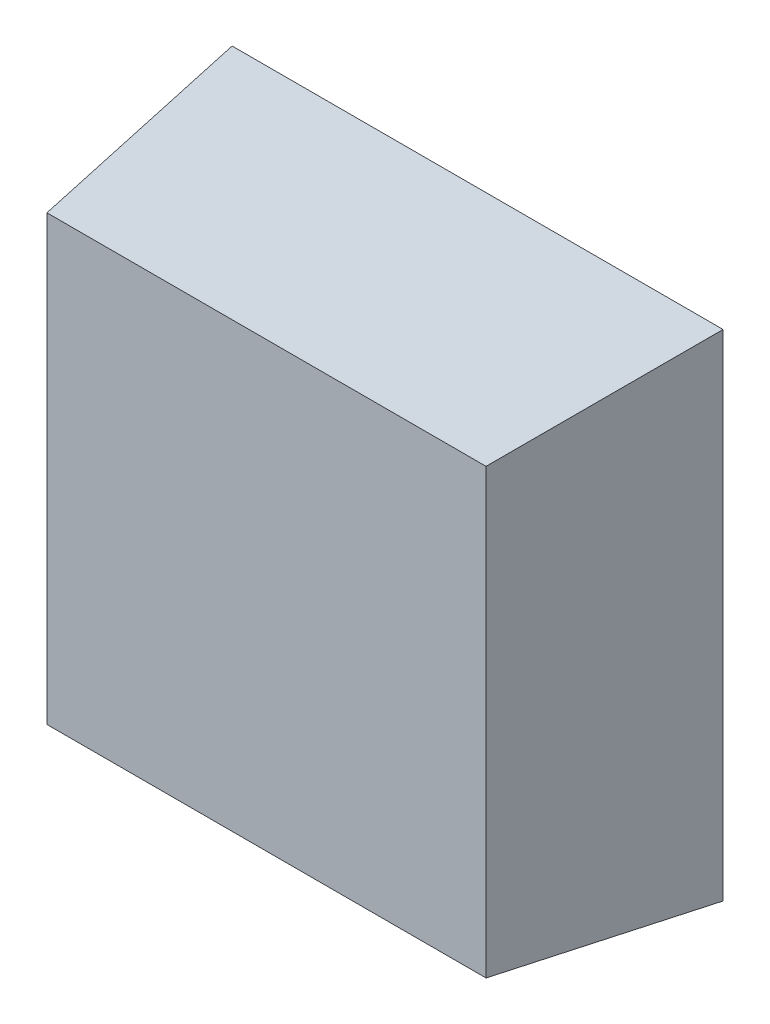
ISO-10303-21;
HEADER;
FILE_DESCRIPTION(('STEP AP214'),'2;1');
FILE_NAME('part.step','',(''),(''),'','','');
FILE_SCHEMA(('AUTOMOTIVE_DESIGN { 1 0 10303 214 1 1 1 1 }'));
ENDSEC;
DATA;
#1=APPLICATION_CONTEXT('core data for automotive mechanical design processes');
#2=APPLICATION_PROTOCOL_DEFINITION('international standard','automotive_design',2000,#1);
#3=PRODUCT_CONTEXT('',#1,'mechanical');
#4=PRODUCT('Part','Part','',(#3));
#5=PRODUCT_RELATED_PRODUCT_CATEGORY('part','',(#4));
#6=PRODUCT_DEFINITION_FORMATION('','',#4);
#7=PRODUCT_DEFINITION_CONTEXT('part definition',#1,'design');
#8=PRODUCT_DEFINITION('design','',#6,#7);
#9=PRODUCT_DEFINITION_SHAPE('','',#8);
#10=(LENGTH_UNIT() NAMED_UNIT(*) SI_UNIT(.MILLI.,.METRE.));
#11=(NAMED_UNIT(*) PLANE_ANGLE_UNIT() SI_UNIT($,.RADIAN.));
#12=(NAMED_UNIT(*) SI_UNIT($,.STERADIAN.) SOLID_ANGLE_UNIT());
#13=UNCERTAINTY_MEASURE_WITH_UNIT(LENGTH_MEASURE(1.E-05),#10,'distance_accuracy_value','');
#14=(GEOMETRIC_REPRESENTATION_CONTEXT(3) GLOBAL_UNCERTAINTY_ASSIGNED_CONTEXT((#13)) GLOBAL_UNIT_ASSIGNED_CONTEXT((#10,
#11,#12)) REPRESENTATION_CONTEXT('',''));
#15=CARTESIAN_POINT('',(0.,0.,0.));
#16=DIRECTION('',(0.,0.,1.));
#17=DIRECTION('',(1.,0.,0.));
#18=AXIS2_PLACEMENT_3D('',#15,#16,#17);
#19=CARTESIAN_POINT('',(-40.592578125,60.40927734375,0.));
#20=DIRECTION('',(-0.992546151641322,0.,0.121869343405148));
#21=DIRECTION('',(0.121869343405148,0.,0.992546151641322));
#22=AXIS2_PLACEMENT_3D('',#19,#20,#21);
#23=PLANE('',#22);
#24=CARTESIAN_POINT('',(-40.2634118836002,20.1347641009306,2.68084390235407));
#25=DIRECTION('',(-0.992546151641322,0.,0.121869343405148));
#26=DIRECTION('',(0.121869343405148,0.,0.992546151641322));
#27=AXIS2_PLACEMENT_3D('',#24,#25,#26);
#28=CIRCLE('',#27,1.5);
#29=CARTESIAN_POINT('',(-40.0806078684925,20.1347641009306,4.16966312981606));
#30=VERTEX_POINT('',#29);
#31=EDGE_CURVE('E11',#30,#30,#28,.T.);
#32=ORIENTED_EDGE('',*,*,#31,.F.);
#33=EDGE_LOOP('',(#32));
#34=FACE_BOUND('',#33,.T.);
#35=CARTESIAN_POINT('',(-40.2441903031807,24.6765860106848,2.83739111218391));
#36=DIRECTION('',(-0.992546151641322,0.,0.121869343405148));
#37=DIRECTION('',(0.121869343405148,0.,0.992546151641322));
#38=AXIS2_PLACEMENT_3D('',#35,#36,#37);
#39=CIRCLE('',#38,1.5);
#40=CARTESIAN_POINT('',(-40.061386288073,24.6765860106848,4.3262103396459));
#41=VERTEX_POINT('',#40);
#42=EDGE_CURVE('E41',#41,#41,#39,.T.);
#43=ORIENTED_EDGE('',*,*,#42,.F.);
#44=EDGE_LOOP('',(#43));
#45=FACE_BOUND('',#44,.T.);
#46=CARTESIAN_POINT('',(-40.2430697440206,29.5708397432577,2.84651733417682));
#47=DIRECTION('',(-0.992546151641322,0.,0.121869343405148));
#48=DIRECTION('',(0.121869343405148,0.,0.992546151641322));
#49=AXIS2_PLACEMENT_3D('',#46,#47,#48);
#50=CIRCLE('',#49,1.5);
#51=CARTESIAN_POINT('',(-40.0602657289129,29.5708397432577,4.3353365616388));
#52=VERTEX_POINT('',#51);
#53=EDGE_CURVE('E117',#52,#52,#50,.T.);
#54=ORIENTED_EDGE('',*,*,#53,.F.);
#55=EDGE_LOOP('',(#54));
#56=FACE_BOUND('',#55,.T.);
#57=CARTESIAN_POINT('',(-40.2338800435718,35.1252794907282,2.92136143820161));
#58=DIRECTION('',(-0.992546151641322,0.,0.121869343405148));
#59=DIRECTION('',(0.121869343405148,0.,0.992546151641322));
#60=AXIS2_PLACEMENT_3D('',#57,#58,#59);
#61=CIRCLE('',#60,1.5);
#62=CARTESIAN_POINT('',(-40.051076028464,35.1252794907282,4.4101806656636));
#63=VERTEX_POINT('',#62);
#64=EDGE_CURVE('E90',#63,#63,#61,.T.);
#65=ORIENTED_EDGE('',*,*,#64,.F.);
#66=EDGE_LOOP('',(#65));
#67=FACE_BOUND('',#66,.T.);
#68=DIRECTION('',(0.,-1.,0.));
#69=VECTOR('',#68,1.);
#70=CARTESIAN_POINT('',(-40.592578125,60.40927734375,0.));
#71=LINE('',#70,#69);
#72=CARTESIAN_POINT('',(-40.592578125,60.40927734375,0.));
#73=VERTEX_POINT('',#72);
#74=CARTESIAN_POINT('',(-40.592578125,-13.89072265625,0.));
#75=VERTEX_POINT('',#74);
#76=EDGE_CURVE('E79',#73,#75,#71,.T.);
#77=ORIENTED_EDGE('',*,*,#76,.T.);
#78=DIRECTION('',(-0.120974291151355,-0.120974291151355,-0.985256536015293));
#79=VECTOR('',#78,1.);
#80=CARTESIAN_POINT('',(-40.592578125,-13.89072265625,0.));
#81=LINE('',#80,#79);
#82=CARTESIAN_POINT('',(-36.701535389987,-9.99967992123695,31.69));
#83=VERTEX_POINT('',#82);
#84=EDGE_CURVE('E86',#83,#75,#81,.T.);
#85=ORIENTED_EDGE('',*,*,#84,.F.);
#86=DIRECTION('',(0.,1.,0.));
#87=VECTOR('',#86,1.);
#88=CARTESIAN_POINT('',(-36.701535389987,60.40927734375,31.69));
#89=LINE('',#88,#87);
#90=CARTESIAN_POINT('',(-36.701535389987,56.5182346087369,31.69));
#91=VERTEX_POINT('',#90);
#92=EDGE_CURVE('E104',#91,#83,#89,.F.);
#93=ORIENTED_EDGE('',*,*,#92,.F.);
#94=DIRECTION('',(-0.120974291151355,0.120974291151355,-0.985256536015293));
#95=VECTOR('',#94,1.);
#96=CARTESIAN_POINT('',(-40.592578125,60.40927734375,0.));
#97=LINE('',#96,#95);
#98=EDGE_CURVE('E94',#91,#73,#97,.T.);
#99=ORIENTED_EDGE('',*,*,#98,.T.);
#100=EDGE_LOOP('',(#77,#85,#93,#99));
#101=FACE_BOUND('',#100,.T.);
#102=ADVANCED_FACE('F33',(#34,#45,#56,#67,#101),#23,.T.);
#103=CARTESIAN_POINT('',(-40.592578125,-13.89072265625,0.));
#104=DIRECTION('',(0.,-0.992546151641322,0.121869343405148));
#105=DIRECTION('',(0.,-0.121869343405148,-0.992546151641322));
#106=AXIS2_PLACEMENT_3D('',#103,#104,#105);
#107=PLANE('',#106);
#108=DIRECTION('',(1.,0.,0.));
#109=VECTOR('',#108,1.);
#110=CARTESIAN_POINT('',(-40.592578125,-13.89072265625,0.));
#111=LINE('',#110,#109);
#112=CARTESIAN_POINT('',(33.107421875,-13.89072265625,0.));
#113=VERTEX_POINT('',#112);
#114=EDGE_CURVE('E74',#75,#113,#111,.T.);
#115=ORIENTED_EDGE('',*,*,#114,.T.);
#116=DIRECTION('',(0.120974291151355,-0.120974291151355,-0.985256536015293));
#117=VECTOR('',#116,1.);
#118=CARTESIAN_POINT('',(32.0200577864157,-12.8033585676657,8.855869830769));
#119=LINE('',#118,#117);
#120=CARTESIAN_POINT('',(29.2163791399869,-9.99967992123695,31.69));
#121=VERTEX_POINT('',#120);
#122=EDGE_CURVE('E91',#121,#113,#119,.T.);
#123=ORIENTED_EDGE('',*,*,#122,.F.);
#124=DIRECTION('',(-1.,0.,0.));
#125=VECTOR('',#124,1.);
#126=CARTESIAN_POINT('',(-40.592578125,-9.99967992123695,31.69));
#127=LINE('',#126,#125);
#128=EDGE_CURVE('E87',#83,#121,#127,.F.);
#129=ORIENTED_EDGE('',*,*,#128,.F.);
#130=ORIENTED_EDGE('',*,*,#84,.T.);
#131=EDGE_LOOP('',(#115,#123,#129,#130));
#132=FACE_BOUND('',#131,.T.);
#133=ADVANCED_FACE('F35',(#132),#107,.T.);
#134=CARTESIAN_POINT('',(33.107421875,60.40927734375,0.));
#135=DIRECTION('',(0.992546151641322,0.,0.121869343405148));
#136=DIRECTION('',(0.121869343405148,0.,-0.992546151641322));
#137=AXIS2_PLACEMENT_3D('',#134,#135,#136);
#138=PLANE('',#137);
#139=DIRECTION('',(0.,1.,0.));
#140=VECTOR('',#139,1.);
#141=CARTESIAN_POINT('',(33.107421875,60.40927734375,0.));
#142=LINE('',#141,#140);
#143=CARTESIAN_POINT('',(33.107421875,60.40927734375,0.));
#144=VERTEX_POINT('',#143);
#145=EDGE_CURVE('E80',#113,#144,#142,.T.);
#146=ORIENTED_EDGE('',*,*,#145,.T.);
#147=DIRECTION('',(0.120974291151355,0.120974291151355,-0.985256536015293));
#148=VECTOR('',#147,1.);
#149=CARTESIAN_POINT('',(32.0288386538875,59.3306941226375,8.78435540414099));
#150=LINE('',#149,#148);
#151=CARTESIAN_POINT('',(29.2163791399869,56.5182346087369,31.69));
#152=VERTEX_POINT('',#151);
#153=EDGE_CURVE('E107',#152,#144,#150,.T.);
#154=ORIENTED_EDGE('',*,*,#153,.F.);
#155=DIRECTION('',(0.,-1.,0.));
#156=VECTOR('',#155,1.);
#157=CARTESIAN_POINT('',(29.2163791399869,60.40927734375,31.69));
#158=LINE('',#157,#156);
#159=EDGE_CURVE('E53',#121,#152,#158,.F.);
#160=ORIENTED_EDGE('',*,*,#159,.F.);
#161=ORIENTED_EDGE('',*,*,#122,.T.);
#162=EDGE_LOOP('',(#146,#154,#160,#161));
#163=FACE_BOUND('',#162,.T.);
#164=ADVANCED_FACE('F153',(#163),#138,.T.);
#165=CARTESIAN_POINT('',(-40.592578125,60.40927734375,0.));
#166=DIRECTION('',(0.,0.992546151641322,0.121869343405148));
#167=DIRECTION('',(0.,-0.121869343405148,0.992546151641322));
#168=AXIS2_PLACEMENT_3D('',#165,#166,#167);
#169=PLANE('',#168);
#170=DIRECTION('',(-1.,0.,0.));
#171=VECTOR('',#170,1.);
#172=CARTESIAN_POINT('',(-40.592578125,60.40927734375,0.));
#173=LINE('',#172,#171);
#174=EDGE_CURVE('E103',#144,#73,#173,.T.);
#175=ORIENTED_EDGE('',*,*,#174,.T.);
#176=ORIENTED_EDGE('',*,*,#98,.F.);
#177=DIRECTION('',(1.,0.,0.));
#178=VECTOR('',#177,1.);
#179=CARTESIAN_POINT('',(-40.592578125,56.5182346087369,31.69));
#180=LINE('',#179,#178);
#181=EDGE_CURVE('E48',#152,#91,#180,.F.);
#182=ORIENTED_EDGE('',*,*,#181,.F.);
#183=ORIENTED_EDGE('',*,*,#153,.T.);
#184=EDGE_LOOP('',(#175,#176,#182,#183));
#185=FACE_BOUND('',#184,.T.);
#186=ADVANCED_FACE('F150',(#185),#169,.T.);
#187=CARTESIAN_POINT('',(0.,0.,31.69));
#188=DIRECTION('',(0.,0.,1.));
#189=DIRECTION('',(1.,0.,0.));
#190=AXIS2_PLACEMENT_3D('',#187,#188,#189);
#191=PLANE('',#190);
#192=ORIENTED_EDGE('',*,*,#92,.T.);
#193=ORIENTED_EDGE('',*,*,#128,.T.);
#194=ORIENTED_EDGE('',*,*,#159,.T.);
#195=ORIENTED_EDGE('',*,*,#181,.T.);
#196=EDGE_LOOP('',(#192,#193,#194,#195));
#197=FACE_BOUND('',#196,.T.);
#198=ADVANCED_FACE('F144',(#197),#191,.T.);
#199=CARTESIAN_POINT('',(0.,0.,0.));
#200=DIRECTION('',(0.,0.,1.));
#201=DIRECTION('',(1.,0.,0.));
#202=AXIS2_PLACEMENT_3D('',#199,#200,#201);
#203=PLANE('',#202);
#204=ORIENTED_EDGE('',*,*,#76,.F.);
#205=ORIENTED_EDGE('',*,*,#174,.F.);
#206=ORIENTED_EDGE('',*,*,#145,.F.);
#207=ORIENTED_EDGE('',*,*,#114,.F.);
#208=EDGE_LOOP('',(#204,#205,#206,#207));
#209=FACE_BOUND('',#208,.T.);
#210=ADVANCED_FACE('F76',(#209),#203,.F.);
#211=CARTESIAN_POINT('',(-50.159341559985,35.1252794907282,4.14005487225308));
#212=DIRECTION('',(0.992546151641322,0.,-0.121869343405147));
#213=DIRECTION('',(-0.121869343405147,0.,-0.992546151641322));
#214=AXIS2_PLACEMENT_3D('',#211,#212,#213);
#215=CYLINDRICAL_SURFACE('',#214,1.5);
#216=CARTESIAN_POINT('',(-50.159341559985,35.1252794907282,4.14005487225308));
#217=DIRECTION('',(-0.992546151641322,0.,0.121869343405148));
#218=DIRECTION('',(0.121869343405148,0.,0.992546151641322));
#219=AXIS2_PLACEMENT_3D('',#216,#217,#218);
#220=CIRCLE('',#219,1.5);
#221=CARTESIAN_POINT('',(-49.9765375448772,35.1252794907282,5.62887409971507));
#222=VERTEX_POINT('',#221);
#223=EDGE_CURVE('E95',#222,#222,#220,.T.);
#224=ORIENTED_EDGE('',*,*,#223,.F.);
#225=EDGE_LOOP('',(#224));
#226=FACE_BOUND('',#225,.T.);
#227=ORIENTED_EDGE('',*,*,#64,.T.);
#228=EDGE_LOOP('',(#227));
#229=FACE_BOUND('',#228,.T.);
#230=ADVANCED_FACE('F132',(#226,#229),#215,.T.);
#231=CARTESIAN_POINT('',(-50.159341559985,35.1252794907282,4.14005487225308));
#232=DIRECTION('',(-0.992546151641322,0.,0.121869343405148));
#233=DIRECTION('',(0.121869343405148,0.,0.992546151641322));
#234=AXIS2_PLACEMENT_3D('',#231,#232,#233);
#235=PLANE('',#234);
#236=ORIENTED_EDGE('',*,*,#223,.T.);
#237=EDGE_LOOP('',(#236));
#238=FACE_BOUND('',#237,.T.);
#239=ADVANCED_FACE('F134',(#238),#235,.T.);
#240=CARTESIAN_POINT('',(-50.1685312604338,29.5708397432577,4.06521076822829));
#241=DIRECTION('',(0.992546151641322,0.,-0.121869343405147));
#242=DIRECTION('',(-0.121869343405147,0.,-0.992546151641322));
#243=AXIS2_PLACEMENT_3D('',#240,#241,#242);
#244=CYLINDRICAL_SURFACE('',#243,1.5);
#245=CARTESIAN_POINT('',(-50.1685312604338,29.5708397432577,4.06521076822829));
#246=DIRECTION('',(-0.992546151641322,0.,0.121869343405148));
#247=DIRECTION('',(0.121869343405148,0.,0.992546151641322));
#248=AXIS2_PLACEMENT_3D('',#245,#246,#247);
#249=CIRCLE('',#248,1.5);
#250=CARTESIAN_POINT('',(-49.9857272453261,29.5708397432577,5.55402999569027));
#251=VERTEX_POINT('',#250);
#252=EDGE_CURVE('E98',#251,#251,#249,.T.);
#253=ORIENTED_EDGE('',*,*,#252,.F.);
#254=EDGE_LOOP('',(#253));
#255=FACE_BOUND('',#254,.T.);
#256=ORIENTED_EDGE('',*,*,#53,.T.);
#257=EDGE_LOOP('',(#256));
#258=FACE_BOUND('',#257,.T.);
#259=ADVANCED_FACE('F141',(#255,#258),#244,.T.);
#260=CARTESIAN_POINT('',(-50.1685312604338,29.5708397432577,4.06521076822829));
#261=DIRECTION('',(-0.992546151641322,0.,0.121869343405148));
#262=DIRECTION('',(0.121869343405148,0.,0.992546151641322));
#263=AXIS2_PLACEMENT_3D('',#260,#261,#262);
#264=PLANE('',#263);
#265=ORIENTED_EDGE('',*,*,#252,.T.);
#266=EDGE_LOOP('',(#265));
#267=FACE_BOUND('',#266,.T.);
#268=ADVANCED_FACE('F202',(#267),#264,.T.);
#269=CARTESIAN_POINT('',(-50.1696518195939,24.6765860106848,4.05608454623539));
#270=DIRECTION('',(0.992546151641322,0.,-0.121869343405147));
#271=DIRECTION('',(-0.121869343405147,0.,-0.992546151641322));
#272=AXIS2_PLACEMENT_3D('',#269,#270,#271);
#273=CYLINDRICAL_SURFACE('',#272,1.5);
#274=CARTESIAN_POINT('',(-50.1696518195939,24.6765860106848,4.05608454623539));
#275=DIRECTION('',(-0.992546151641322,0.,0.121869343405148));
#276=DIRECTION('',(0.121869343405148,0.,0.992546151641322));
#277=AXIS2_PLACEMENT_3D('',#274,#275,#276);
#278=CIRCLE('',#277,1.5);
#279=CARTESIAN_POINT('',(-49.9868478044862,24.6765860106848,5.54490377369737));
#280=VERTEX_POINT('',#279);
#281=EDGE_CURVE('E213',#280,#280,#278,.T.);
#282=ORIENTED_EDGE('',*,*,#281,.F.);
#283=EDGE_LOOP('',(#282));
#284=FACE_BOUND('',#283,.T.);
#285=ORIENTED_EDGE('',*,*,#42,.T.);
#286=EDGE_LOOP('',(#285));
#287=FACE_BOUND('',#286,.T.);
#288=ADVANCED_FACE('F122',(#284,#287),#273,.T.);
#289=CARTESIAN_POINT('',(-50.1696518195939,24.6765860106848,4.05608454623539));
#290=DIRECTION('',(-0.992546151641322,0.,0.121869343405148));
#291=DIRECTION('',(0.121869343405148,0.,0.992546151641322));
#292=AXIS2_PLACEMENT_3D('',#289,#290,#291);
#293=PLANE('',#292);
#294=ORIENTED_EDGE('',*,*,#281,.T.);
#295=EDGE_LOOP('',(#294));
#296=FACE_BOUND('',#295,.T.);
#297=ADVANCED_FACE('F172',(#296),#293,.T.);
#298=CARTESIAN_POINT('',(-50.1888734000134,20.1347641009306,3.89953733640554));
#299=DIRECTION('',(0.992546151641322,0.,-0.121869343405147));
#300=DIRECTION('',(-0.121869343405147,0.,-0.992546151641322));
#301=AXIS2_PLACEMENT_3D('',#298,#299,#300);
#302=CYLINDRICAL_SURFACE('',#301,1.5);
#303=CARTESIAN_POINT('',(-50.1888734000134,20.1347641009306,3.89953733640554));
#304=DIRECTION('',(-0.992546151641322,0.,0.121869343405148));
#305=DIRECTION('',(0.121869343405148,0.,0.992546151641322));
#306=AXIS2_PLACEMENT_3D('',#303,#304,#305);
#307=CIRCLE('',#306,1.5);
#308=CARTESIAN_POINT('',(-50.0060693849057,20.1347641009306,5.38835656386753));
#309=VERTEX_POINT('',#308);
#310=EDGE_CURVE('E215',#309,#309,#307,.T.);
#311=ORIENTED_EDGE('',*,*,#310,.F.);
#312=EDGE_LOOP('',(#311));
#313=FACE_BOUND('',#312,.T.);
#314=ORIENTED_EDGE('',*,*,#31,.T.);
#315=EDGE_LOOP('',(#314));
#316=FACE_BOUND('',#315,.T.);
#317=ADVANCED_FACE('F177',(#313,#316),#302,.T.);
#318=CARTESIAN_POINT('',(-50.1888734000134,20.1347641009306,3.89953733640554));
#319=DIRECTION('',(-0.992546151641322,0.,0.121869343405148));
#320=DIRECTION('',(0.121869343405148,0.,0.992546151641322));
#321=AXIS2_PLACEMENT_3D('',#318,#319,#320);
#322=PLANE('',#321);
#323=ORIENTED_EDGE('',*,*,#310,.T.);
#324=EDGE_LOOP('',(#323));
#325=FACE_BOUND('',#324,.T.);
#326=ADVANCED_FACE('F182',(#325),#322,.T.);
#327=CLOSED_SHELL('',(#102,#133,#164,#186,#198,#210,#230,#239,#259,#268,#288,#297,#317,#326));
#328=MANIFOLD_SOLID_BREP('B2',#327);
#329=ADVANCED_BREP_SHAPE_REPRESENTATION('',(#18,#328),#14);
#330=SHAPE_DEFINITION_REPRESENTATION(#9,#329);
ENDSEC;
END-ISO-10303-21;
